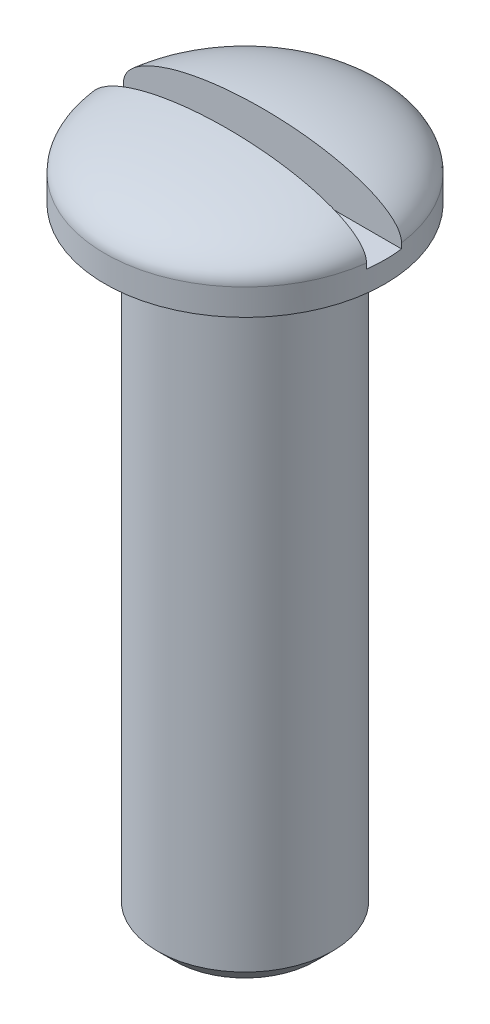
ISO-10303-21;
HEADER;
FILE_DESCRIPTION(('STEP AP214'),'2;1');
FILE_NAME('part.step','',(''),(''),'','','');
FILE_SCHEMA(('AUTOMOTIVE_DESIGN { 1 0 10303 214 1 1 1 1 }'));
ENDSEC;
DATA;
#1=APPLICATION_CONTEXT('core data for automotive mechanical design processes');
#2=APPLICATION_PROTOCOL_DEFINITION('international standard','automotive_design',2000,#1);
#3=PRODUCT_CONTEXT('',#1,'mechanical');
#4=PRODUCT('Part','Part','',(#3));
#5=PRODUCT_RELATED_PRODUCT_CATEGORY('part','',(#4));
#6=PRODUCT_DEFINITION_FORMATION('','',#4);
#7=PRODUCT_DEFINITION_CONTEXT('part definition',#1,'design');
#8=PRODUCT_DEFINITION('design','',#6,#7);
#9=PRODUCT_DEFINITION_SHAPE('','',#8);
#10=(LENGTH_UNIT() NAMED_UNIT(*) SI_UNIT(.MILLI.,.METRE.));
#11=(NAMED_UNIT(*) PLANE_ANGLE_UNIT() SI_UNIT($,.RADIAN.));
#12=(NAMED_UNIT(*) SI_UNIT($,.STERADIAN.) SOLID_ANGLE_UNIT());
#13=UNCERTAINTY_MEASURE_WITH_UNIT(LENGTH_MEASURE(1.E-05),#10,'distance_accuracy_value','');
#14=(GEOMETRIC_REPRESENTATION_CONTEXT(3) GLOBAL_UNCERTAINTY_ASSIGNED_CONTEXT((#13)) GLOBAL_UNIT_ASSIGNED_CONTEXT((#10,
#11,#12)) REPRESENTATION_CONTEXT('',''));
#15=CARTESIAN_POINT('',(0.,0.,0.));
#16=DIRECTION('',(0.,0.,1.));
#17=DIRECTION('',(1.,0.,0.));
#18=AXIS2_PLACEMENT_3D('',#15,#16,#17);
#19=CARTESIAN_POINT('',(0.,37.,0.));
#20=DIRECTION('',(0.,0.,1.));
#21=DIRECTION('',(1.,0.,0.));
#22=AXIS2_PLACEMENT_3D('',#19,#20,#21);
#23=ELLIPSE('',#22,8.,2.7);
#24=TRIMMED_CURVE('',#23,(PARAMETER_VALUE(-1.5707963267949)),(PARAMETER_VALUE(1.5707963267949)),
.T.,.PARAMETER.);
#25=CARTESIAN_POINT('',(0.,0.,0.));
#26=DIRECTION('',(0.,-1.,0.));
#27=AXIS1_PLACEMENT('',#25,#26);
#28=SURFACE_OF_REVOLUTION('',#24,#27);
#29=CARTESIAN_POINT('',(-7.93725393319377,37.,-1.));
#30=CARTESIAN_POINT('',(-7.9372679539927,37.028425186696,-1.));
#31=CARTESIAN_POINT('',(-7.93591384815377,37.0568421998398,-1.));
#32=CARTESIAN_POINT('',(-7.93057860445809,37.1133921509441,-1.));
#33=CARTESIAN_POINT('',(-7.92660092033622,37.141525413073,-1.));
#34=CARTESIAN_POINT('',(-7.91619381617088,37.1969612867804,-1.));
#35=CARTESIAN_POINT('',(-7.9097962183802,37.2242699119832,-1.));
#36=CARTESIAN_POINT('',(-7.89472838102949,37.2782541235067,-0.999999999999999));
#37=CARTESIAN_POINT('',(-7.88605729440098,37.3049294698286,-0.999999999999997));
#38=CARTESIAN_POINT('',(-7.85178063449509,37.3977492993282,-0.999999999999993));
#39=CARTESIAN_POINT('',(-7.82055716977038,37.461864801042,-0.999999999999998));
#40=CARTESIAN_POINT('',(-7.74825690551775,37.5844958132068,-1.));
#41=CARTESIAN_POINT('',(-7.70712574237137,37.6429778439168,-1.));
#42=CARTESIAN_POINT('',(-7.62460477383432,37.7460593120359,-1.));
#43=CARTESIAN_POINT('',(-7.58416021714071,37.7914307085018,-1.));
#44=CARTESIAN_POINT('',(-7.49949954701128,37.8785364853327,-1.));
#45=CARTESIAN_POINT('',(-7.45528055201993,37.920268036859,-1.));
#46=CARTESIAN_POINT('',(-7.36394506845197,38.0005355231512,-1.));
#47=CARTESIAN_POINT('',(-7.31682453080931,38.0390668075451,-1.));
#48=CARTESIAN_POINT('',(-7.22040376655296,38.1132464906887,-1.));
#49=CARTESIAN_POINT('',(-7.17110414952075,38.1488956878849,-1.));
#50=CARTESIAN_POINT('',(-7.05152178589472,38.2308701890934,-1.));
#51=CARTESIAN_POINT('',(-6.98044898629355,38.2760404643861,-1.));
#52=CARTESIAN_POINT('',(-6.8358482477968,38.3622929197311,-1.));
#53=CARTESIAN_POINT('',(-6.76231921632544,38.4033732472718,-1.));
#54=CARTESIAN_POINT('',(-6.61329455065616,38.4820633862059,-1.));
#55=CARTESIAN_POINT('',(-6.53779612171528,38.5196678782305,-1.));
#56=CARTESIAN_POINT('',(-6.38533535109786,38.5917942620324,-1.));
#57=CARTESIAN_POINT('',(-6.30837275926801,38.6263156212117,-1.));
#58=CARTESIAN_POINT('',(-6.07504498630673,38.7261169145836,-1.));
#59=CARTESIAN_POINT('',(-5.91691686569097,38.7872866492436,-1.));
#60=CARTESIAN_POINT('',(-5.59773824980062,38.9007826154434,-1.));
#61=CARTESIAN_POINT('',(-5.43669046126721,38.9531166162706,-1.));
#62=CARTESIAN_POINT('',(-5.11838729614728,39.0486486509022,-1.));
#63=CARTESIAN_POINT('',(-4.96121112165104,39.092112450686,-1.));
#64=CARTESIAN_POINT('',(-4.64533614080023,39.173148532359,-1.));
#65=CARTESIAN_POINT('',(-4.4866371255672,39.2107199934119,-1.));
#66=CARTESIAN_POINT('',(-4.1678604359053,39.2806895318816,-1.));
#67=CARTESIAN_POINT('',(-4.00778105851083,39.313079811176,-1.));
#68=CARTESIAN_POINT('',(-3.68673226498379,39.3731227554639,-1.));
#69=CARTESIAN_POINT('',(-3.52576278469573,39.4007750742435,-1.));
#70=CARTESIAN_POINT('',(-3.0416024744178,39.4772597557472,-1.));
#71=CARTESIAN_POINT('',(-2.7173689548059,39.5195751626911,-1.));
#72=CARTESIAN_POINT('',(-2.06670375945056,39.5889826128706,-1.));
#73=CARTESIAN_POINT('',(-1.74026908381822,39.6160456762821,-1.));
#74=CARTESIAN_POINT('',(-1.0868675348501,39.6559517029133,-1.));
#75=CARTESIAN_POINT('',(-0.759901523204662,39.6688088956982,-1.));
#76=CARTESIAN_POINT('',(-0.105842030838195,39.6808640766637,-1.));
#77=CARTESIAN_POINT('',(0.221251354184301,39.6800672551695,-1.));
#78=CARTESIAN_POINT('',(0.805290745504496,39.6664179409489,-1.));
#79=CARTESIAN_POINT('',(1.06230047698938,39.6561762053847,-1.));
#80=CARTESIAN_POINT('',(1.5758871235112,39.6269652511818,-1.));
#81=CARTESIAN_POINT('',(1.83246393174541,39.6079941266835,-1.));
#82=CARTESIAN_POINT('',(2.34490379464668,39.5608224933159,-1.));
#83=CARTESIAN_POINT('',(2.60076642804317,39.5326173721284,-1.));
#84=CARTESIAN_POINT('',(3.10976030056053,39.4663704493105,-1.));
#85=CARTESIAN_POINT('',(3.36289880378432,39.4283851568984,-1.));
#86=CARTESIAN_POINT('',(3.86716913883653,39.3413164140507,-1.));
#87=CARTESIAN_POINT('',(4.11830173526058,39.2922374239431,-1.));
#88=CARTESIAN_POINT('',(4.61755910251831,39.1811940716012,-1.));
#89=CARTESIAN_POINT('',(4.86568622251569,39.1192405666533,-1.));
#90=CARTESIAN_POINT('',(5.20204631769779,39.0236658400096,-1.));
#91=CARTESIAN_POINT('',(5.29223913160667,38.9968795643075,-1.));
#92=CARTESIAN_POINT('',(5.47189294855613,38.9409436912467,-1.));
#93=CARTESIAN_POINT('',(5.5613539536697,38.9117941005851,-1.));
#94=CARTESIAN_POINT('',(5.73961871133747,38.8508089779762,-1.));
#95=CARTESIAN_POINT('',(5.82842014912198,38.8189666570215,-1.));
#96=CARTESIAN_POINT('',(6.00491789080109,38.7523528819634,-1.));
#97=CARTESIAN_POINT('',(6.09261423406394,38.7175815325458,-1.));
#98=CARTESIAN_POINT('',(6.2776295683126,38.6401174364544,-1.));
#99=CARTESIAN_POINT('',(6.37476339184213,38.5969789898256,-1.));
#100=CARTESIAN_POINT('',(6.56669545755528,38.5057942312038,-1.));
#101=CARTESIAN_POINT('',(6.66149417144632,38.4577489206899,-1.));
#102=CARTESIAN_POINT('',(6.84759019964439,38.3559697683412,-1.));
#103=CARTESIAN_POINT('',(6.93889852072794,38.302256240792,-1.));
#104=CARTESIAN_POINT('',(7.11693757439327,38.187786452014,-1.));
#105=CARTESIAN_POINT('',(7.20367310459747,38.1270377947718,-1.));
#106=CARTESIAN_POINT('',(7.35169707600426,38.0113239182405,-1.));
#107=CARTESIAN_POINT('',(7.41433656069576,37.9581066351191,-1.));
#108=CARTESIAN_POINT('',(7.53389423860408,37.8452426401833,-1.));
#109=CARTESIAN_POINT('',(7.59079865654612,37.7855811292181,-1.));
#110=CARTESIAN_POINT('',(7.69680275770274,37.6577690604176,-1.));
#111=CARTESIAN_POINT('',(7.7457630485013,37.5894979859558,-0.999999999999999));
#112=CARTESIAN_POINT('',(7.80882672013688,37.481331738079,-1.));
#113=CARTESIAN_POINT('',(7.82807745616976,37.4444318562314,-1.));
#114=CARTESIAN_POINT('',(7.86249520103261,37.3687911619656,-0.999999999999999));
#115=CARTESIAN_POINT('',(7.87766543085493,37.3300518301273,-0.999999999999997));
#116=CARTESIAN_POINT('',(7.90549829208587,37.2439124725726,-0.999999999999997));
#117=CARTESIAN_POINT('',(7.91723093808099,37.1962001972984,-0.999999999999999));
#118=CARTESIAN_POINT('',(7.92915192399331,37.123467437178,-1.));
#119=CARTESIAN_POINT('',(7.93217994650022,37.0988886368039,-1.));
#120=CARTESIAN_POINT('',(7.93623444838613,37.0495440864978,-1.));
#121=CARTESIAN_POINT('',(7.93725906810871,37.0247781842705,-1.));
#122=CARTESIAN_POINT('',(7.93725393319377,37.,-1.));
#123=B_SPLINE_CURVE_WITH_KNOTS('',3,(#29,#30,#31,#32,#33,#34,#35,#36,#37,#38,#39,#40,#41,#42,
#43,#44,#45,#46,#47,#48,#49,#50,#51,#52,#53,#54,#55,#56,#57,#58,#59,#60,#61,#62,#63,#64,#65,#66,
#67,#68,#69,#70,#71,#72,#73,#74,#75,#76,#77,#78,#79,#80,#81,#82,#83,#84,#85,#86,#87,#88,#89,#90,
#91,#92,#93,#94,#95,#96,#97,#98,#99,#100,#101,#102,#103,#104,#105,#106,#107,#108,#109,#110,#111,
#112,#113,#114,#115,#116,#117,#118,#119,#120,#121,#122),.UNSPECIFIED.,.F.,.F.,(4,2,2,2,2,2,2,2,
2,2,2,2,2,2,2,2,2,2,2,2,2,2,2,2,2,2,2,2,2,2,2,2,2,2,2,2,2,2,2,2,2,2,2,2,2,2,4),(0.,
0.085230121730039,0.170348268030959,0.254383958606268,0.33845100424637,0.551085654244598,
0.764914730326498,0.946993520486736,1.12921258182631,1.31169195823799,1.494120606517,
1.7465796309848,1.99915248957964,2.25210569478696,2.50510251241691,3.01337352121526,
3.52119525149152,4.01028728520159,4.49944739181178,4.98933693637674,5.47926226308226,
6.45975371972949,7.44210190711809,8.42346521325528,9.40445548025946,10.1759607647509,
10.9476345695116,11.7196944096484,12.487389709664,13.2547768976915,14.0215195429876,
14.3037539915994,14.5859876404534,14.8689553875985,15.1519130255422,15.4706443815909,
15.7893108148479,16.1068716569271,16.4240924087716,16.6703252972271,16.917136190868,
17.1678947543991,17.2925517948105,17.4171101451146,17.5638867740028,17.6381082525873,
17.71239859453),.UNSPECIFIED.);
#124=CARTESIAN_POINT('',(-7.93725393319377,37.,-1.));
#125=VERTEX_POINT('',#124);
#126=CARTESIAN_POINT('',(7.93725393319377,37.,-1.));
#127=VERTEX_POINT('',#126);
#128=EDGE_CURVE('E107',#125,#127,#123,.T.);
#129=ORIENTED_EDGE('',*,*,#128,.T.);
#130=CARTESIAN_POINT('',(0.,37.,0.));
#131=DIRECTION('',(0.,1.,0.));
#132=DIRECTION('',(1.,0.,0.));
#133=AXIS2_PLACEMENT_3D('',#130,#131,#132);
#134=CIRCLE('',#133,8.);
#135=EDGE_CURVE('E151',#127,#125,#134,.T.);
#136=ORIENTED_EDGE('',*,*,#135,.T.);
#137=EDGE_LOOP('',(#129,#136));
#138=FACE_BOUND('',#137,.T.);
#139=ADVANCED_FACE('F45',(#138),#28,.F.);
#140=CARTESIAN_POINT('',(0.,0.,0.));
#141=DIRECTION('',(0.,-1.,0.));
#142=DIRECTION('',(1.,0.,0.));
#143=AXIS2_PLACEMENT_3D('',#140,#141,#142);
#144=PLANE('',#143);
#145=CARTESIAN_POINT('',(0.,0.,0.));
#146=DIRECTION('',(0.,1.,0.));
#147=DIRECTION('',(1.,0.,0.));
#148=AXIS2_PLACEMENT_3D('',#145,#146,#147);
#149=CIRCLE('',#148,3.99999999999999);
#150=CARTESIAN_POINT('',(3.99999999999999,0.,0.));
#151=VERTEX_POINT('',#150);
#152=EDGE_CURVE('E160',#151,#151,#149,.T.);
#153=ORIENTED_EDGE('',*,*,#152,.F.);
#154=EDGE_LOOP('',(#153));
#155=FACE_BOUND('',#154,.T.);
#156=ADVANCED_FACE('F174',(#155),#144,.T.);
#157=CARTESIAN_POINT('',(0.,0.,0.));
#158=DIRECTION('',(0.,-1.,0.));
#159=DIRECTION('',(1.,0.,0.));
#160=AXIS2_PLACEMENT_3D('',#157,#158,#159);
#161=CYLINDRICAL_SURFACE('',#160,5.);
#162=CARTESIAN_POINT('',(0.,1.00000000000001,0.));
#163=DIRECTION('',(0.,1.,0.));
#164=DIRECTION('',(1.,0.,0.));
#165=AXIS2_PLACEMENT_3D('',#162,#163,#164);
#166=CIRCLE('',#165,5.);
#167=CARTESIAN_POINT('',(5.,1.00000000000001,0.));
#168=VERTEX_POINT('',#167);
#169=EDGE_CURVE('E117',#168,#168,#166,.F.);
#170=ORIENTED_EDGE('',*,*,#169,.F.);
#171=EDGE_LOOP('',(#170));
#172=FACE_BOUND('',#171,.T.);
#173=CARTESIAN_POINT('',(0.,35.5,0.));
#174=DIRECTION('',(0.,1.,0.));
#175=DIRECTION('',(1.,0.,0.));
#176=AXIS2_PLACEMENT_3D('',#173,#174,#175);
#177=CIRCLE('',#176,5.);
#178=CARTESIAN_POINT('',(5.,35.5,0.));
#179=VERTEX_POINT('',#178);
#180=EDGE_CURVE('E156',#179,#179,#177,.T.);
#181=ORIENTED_EDGE('',*,*,#180,.F.);
#182=EDGE_LOOP('',(#181));
#183=FACE_BOUND('',#182,.T.);
#184=ADVANCED_FACE('F170',(#172,#183),#161,.T.);
#185=CARTESIAN_POINT('',(5.,35.5,0.));
#186=DIRECTION('',(0.,-1.,0.));
#187=DIRECTION('',(1.,0.,0.));
#188=AXIS2_PLACEMENT_3D('',#185,#186,#187);
#189=PLANE('',#188);
#190=CARTESIAN_POINT('',(0.,35.5,0.));
#191=DIRECTION('',(0.,1.,0.));
#192=DIRECTION('',(1.,0.,0.));
#193=AXIS2_PLACEMENT_3D('',#190,#191,#192);
#194=CIRCLE('',#193,8.);
#195=CARTESIAN_POINT('',(8.,35.5,0.));
#196=VERTEX_POINT('',#195);
#197=EDGE_CURVE('E152',#196,#196,#194,.T.);
#198=ORIENTED_EDGE('',*,*,#197,.F.);
#199=EDGE_LOOP('',(#198));
#200=FACE_BOUND('',#199,.T.);
#201=ORIENTED_EDGE('',*,*,#180,.T.);
#202=EDGE_LOOP('',(#201));
#203=FACE_BOUND('',#202,.T.);
#204=ADVANCED_FACE('F173',(#200,#203),#189,.T.);
#205=CARTESIAN_POINT('',(0.,0.,0.));
#206=DIRECTION('',(0.,-1.,0.));
#207=DIRECTION('',(1.,0.,0.));
#208=AXIS2_PLACEMENT_3D('',#205,#206,#207);
#209=CYLINDRICAL_SURFACE('',#208,8.);
#210=DIRECTION('',(0.,-1.,0.));
#211=VECTOR('',#210,1.);
#212=CARTESIAN_POINT('',(-7.93725393319377,0.,-1.));
#213=LINE('',#212,#211);
#214=CARTESIAN_POINT('',(-7.93725393319377,36.7,-1.));
#215=VERTEX_POINT('',#214);
#216=EDGE_CURVE('E146',#215,#125,#213,.F.);
#217=ORIENTED_EDGE('',*,*,#216,.T.);
#218=ORIENTED_EDGE('',*,*,#135,.F.);
#219=DIRECTION('',(0.,-1.,0.));
#220=VECTOR('',#219,1.);
#221=CARTESIAN_POINT('',(7.93725393319377,0.,-1.));
#222=LINE('',#221,#220);
#223=CARTESIAN_POINT('',(7.93725393319377,36.7,-1.));
#224=VERTEX_POINT('',#223);
#225=EDGE_CURVE('E69',#127,#224,#222,.T.);
#226=ORIENTED_EDGE('',*,*,#225,.T.);
#227=CARTESIAN_POINT('',(0.,36.7,0.));
#228=DIRECTION('',(0.,1.,0.));
#229=DIRECTION('',(0.,0.,1.));
#230=AXIS2_PLACEMENT_3D('',#227,#228,#229);
#231=CIRCLE('',#230,8.);
#232=CARTESIAN_POINT('',(7.93725393319377,36.7,1.));
#233=VERTEX_POINT('',#232);
#234=EDGE_CURVE('E49',#224,#233,#231,.F.);
#235=ORIENTED_EDGE('',*,*,#234,.T.);
#236=DIRECTION('',(0.,-1.,0.));
#237=VECTOR('',#236,1.);
#238=CARTESIAN_POINT('',(7.93725393319377,0.,1.));
#239=LINE('',#238,#237);
#240=CARTESIAN_POINT('',(7.93725393319377,37.,1.));
#241=VERTEX_POINT('',#240);
#242=EDGE_CURVE('E97',#233,#241,#239,.F.);
#243=ORIENTED_EDGE('',*,*,#242,.T.);
#244=CARTESIAN_POINT('',(-7.93725393319377,37.,1.));
#245=VERTEX_POINT('',#244);
#246=EDGE_CURVE('E148',#245,#241,#134,.T.);
#247=ORIENTED_EDGE('',*,*,#246,.F.);
#248=DIRECTION('',(0.,-1.,0.));
#249=VECTOR('',#248,1.);
#250=CARTESIAN_POINT('',(-7.93725393319377,0.,1.));
#251=LINE('',#250,#249);
#252=CARTESIAN_POINT('',(-7.93725393319377,36.7,1.));
#253=VERTEX_POINT('',#252);
#254=EDGE_CURVE('E102',#245,#253,#251,.T.);
#255=ORIENTED_EDGE('',*,*,#254,.T.);
#256=EDGE_CURVE('E11',#253,#215,#231,.F.);
#257=ORIENTED_EDGE('',*,*,#256,.T.);
#258=EDGE_LOOP('',(#217,#218,#226,#235,#243,#247,#255,#257));
#259=FACE_BOUND('',#258,.T.);
#260=ORIENTED_EDGE('',*,*,#197,.T.);
#261=EDGE_LOOP('',(#260));
#262=FACE_BOUND('',#261,.T.);
#263=ADVANCED_FACE('F104',(#259,#262),#209,.T.);
#264=CARTESIAN_POINT('',(7.93725393319377,37.,1.));
#265=CARTESIAN_POINT('',(7.9372679539927,37.028425186696,1.));
#266=CARTESIAN_POINT('',(7.93591384815377,37.0568421998398,1.));
#267=CARTESIAN_POINT('',(7.93057860445809,37.1133921509441,1.));
#268=CARTESIAN_POINT('',(7.92660092033622,37.141525413073,1.));
#269=CARTESIAN_POINT('',(7.91619381617087,37.1969612867804,1.));
#270=CARTESIAN_POINT('',(7.9097962183802,37.2242699119832,1.));
#271=CARTESIAN_POINT('',(7.89472838102949,37.2782541235067,0.999999999999999));
#272=CARTESIAN_POINT('',(7.88605729440098,37.3049294698286,0.999999999999998));
#273=CARTESIAN_POINT('',(7.85178063449509,37.3977492993282,0.999999999999995));
#274=CARTESIAN_POINT('',(7.82055716977038,37.461864801042,0.999999999999998));
#275=CARTESIAN_POINT('',(7.74825690551775,37.5844958132068,1.));
#276=CARTESIAN_POINT('',(7.70712574237137,37.6429778439168,1.));
#277=CARTESIAN_POINT('',(7.62460477383432,37.7460593120359,1.));
#278=CARTESIAN_POINT('',(7.58416021714071,37.7914307085019,1.));
#279=CARTESIAN_POINT('',(7.49949954701128,37.8785364853327,1.));
#280=CARTESIAN_POINT('',(7.45528055201992,37.920268036859,1.));
#281=CARTESIAN_POINT('',(7.36394506845197,38.0005355231512,1.));
#282=CARTESIAN_POINT('',(7.31682453080931,38.0390668075451,1.));
#283=CARTESIAN_POINT('',(7.22040376655296,38.1132464906887,1.));
#284=CARTESIAN_POINT('',(7.17110414952075,38.1488956878849,1.));
#285=CARTESIAN_POINT('',(7.05152178589472,38.2308701890934,1.));
#286=CARTESIAN_POINT('',(6.98044898629355,38.2760404643861,1.));
#287=CARTESIAN_POINT('',(6.8358482477968,38.3622929197311,0.999999999999999));
#288=CARTESIAN_POINT('',(6.76231921632544,38.4033732472718,1.));
#289=CARTESIAN_POINT('',(6.61329455065617,38.4820633862059,1.));
#290=CARTESIAN_POINT('',(6.53779612171528,38.5196678782305,1.));
#291=CARTESIAN_POINT('',(6.38533535109786,38.5917942620324,1.));
#292=CARTESIAN_POINT('',(6.30837275926801,38.6263156212117,1.));
#293=CARTESIAN_POINT('',(6.07504498630673,38.7261169145836,1.));
#294=CARTESIAN_POINT('',(5.91691686569096,38.7872866492436,1.));
#295=CARTESIAN_POINT('',(5.59773824980061,38.9007826154434,1.));
#296=CARTESIAN_POINT('',(5.4366904612672,38.9531166162706,1.));
#297=CARTESIAN_POINT('',(5.11838729614728,39.0486486509022,1.));
#298=CARTESIAN_POINT('',(4.96121112165104,39.092112450686,1.));
#299=CARTESIAN_POINT('',(4.64533614080023,39.173148532359,1.));
#300=CARTESIAN_POINT('',(4.4866371255672,39.2107199934119,1.));
#301=CARTESIAN_POINT('',(4.1678604359053,39.2806895318816,1.));
#302=CARTESIAN_POINT('',(4.00778105851082,39.313079811176,1.));
#303=CARTESIAN_POINT('',(3.68673226498379,39.3731227554639,1.));
#304=CARTESIAN_POINT('',(3.52576278469573,39.4007750742435,1.));
#305=CARTESIAN_POINT('',(3.04160247441779,39.4772597557472,1.));
#306=CARTESIAN_POINT('',(2.7173689548059,39.5195751626911,1.));
#307=CARTESIAN_POINT('',(2.06670375945055,39.5889826128706,1.));
#308=CARTESIAN_POINT('',(1.74026908381821,39.6160456762821,1.));
#309=CARTESIAN_POINT('',(1.0868675348501,39.6559517029133,1.));
#310=CARTESIAN_POINT('',(0.759901523204655,39.6688088956982,1.));
#311=CARTESIAN_POINT('',(0.105842030838188,39.6808640766637,1.));
#312=CARTESIAN_POINT('',(-0.221251354184309,39.6800672551695,0.999999999999999));
#313=CARTESIAN_POINT('',(-0.805290745504502,39.6664179409489,0.999999999999999));
#314=CARTESIAN_POINT('',(-1.06230047698939,39.6561762053847,1.));
#315=CARTESIAN_POINT('',(-1.5758871235112,39.6269652511818,1.));
#316=CARTESIAN_POINT('',(-1.83246393174541,39.6079941266835,1.));
#317=CARTESIAN_POINT('',(-2.34490379464668,39.5608224933159,1.));
#318=CARTESIAN_POINT('',(-2.60076642804317,39.5326173721284,1.));
#319=CARTESIAN_POINT('',(-3.10976030056052,39.4663704493105,1.));
#320=CARTESIAN_POINT('',(-3.36289880378431,39.4283851568984,1.));
#321=CARTESIAN_POINT('',(-3.86716913883652,39.3413164140507,1.));
#322=CARTESIAN_POINT('',(-4.11830173526056,39.2922374239431,1.));
#323=CARTESIAN_POINT('',(-4.61755910251829,39.1811940716012,1.));
#324=CARTESIAN_POINT('',(-4.86568622251567,39.1192405666533,1.));
#325=CARTESIAN_POINT('',(-5.20204631769776,39.0236658400096,1.));
#326=CARTESIAN_POINT('',(-5.29223913160664,38.9968795643075,1.));
#327=CARTESIAN_POINT('',(-5.47189294855611,38.9409436912467,1.));
#328=CARTESIAN_POINT('',(-5.56135395366969,38.9117941005851,1.));
#329=CARTESIAN_POINT('',(-5.73961871133745,38.8508089779762,1.));
#330=CARTESIAN_POINT('',(-5.82842014912197,38.8189666570215,1.));
#331=CARTESIAN_POINT('',(-6.00491789080107,38.7523528819634,1.));
#332=CARTESIAN_POINT('',(-6.09261423406392,38.7175815325458,1.));
#333=CARTESIAN_POINT('',(-6.27762956831259,38.6401174364544,1.));
#334=CARTESIAN_POINT('',(-6.37476339184211,38.5969789898256,1.));
#335=CARTESIAN_POINT('',(-6.56669545755526,38.5057942312038,1.));
#336=CARTESIAN_POINT('',(-6.66149417144631,38.4577489206899,1.));
#337=CARTESIAN_POINT('',(-6.84759019964437,38.3559697683412,1.));
#338=CARTESIAN_POINT('',(-6.93889852072792,38.302256240792,1.));
#339=CARTESIAN_POINT('',(-7.11693757439326,38.187786452014,1.));
#340=CARTESIAN_POINT('',(-7.20367310459746,38.1270377947718,1.));
#341=CARTESIAN_POINT('',(-7.35169707600426,38.0113239182405,1.));
#342=CARTESIAN_POINT('',(-7.41433656069576,37.9581066351191,1.));
#343=CARTESIAN_POINT('',(-7.53389423860408,37.8452426401833,1.));
#344=CARTESIAN_POINT('',(-7.59079865654611,37.7855811292181,0.999999999999999));
#345=CARTESIAN_POINT('',(-7.69680275770273,37.6577690604176,0.999999999999999));
#346=CARTESIAN_POINT('',(-7.74576304850129,37.5894979859559,0.999999999999999));
#347=CARTESIAN_POINT('',(-7.80882672013687,37.481331738079,1.));
#348=CARTESIAN_POINT('',(-7.82807745616975,37.4444318562314,1.));
#349=CARTESIAN_POINT('',(-7.8624952010326,37.3687911619656,0.999999999999999));
#350=CARTESIAN_POINT('',(-7.87766543085493,37.3300518301273,0.999999999999997));
#351=CARTESIAN_POINT('',(-7.90549829208588,37.2439124725726,0.999999999999996));
#352=CARTESIAN_POINT('',(-7.91723093808099,37.1962001972984,0.999999999999999));
#353=CARTESIAN_POINT('',(-7.92915192399331,37.123467437178,1.));
#354=CARTESIAN_POINT('',(-7.93217994650022,37.0988886368039,1.));
#355=CARTESIAN_POINT('',(-7.93623444838613,37.0495440864978,1.));
#356=CARTESIAN_POINT('',(-7.93725906810871,37.0247781842705,0.999999999999999));
#357=CARTESIAN_POINT('',(-7.93725393319377,37.,0.999999999999999));
#358=B_SPLINE_CURVE_WITH_KNOTS('',3,(#264,#265,#266,#267,#268,#269,#270,#271,#272,#273,#274,
#275,#276,#277,#278,#279,#280,#281,#282,#283,#284,#285,#286,#287,#288,#289,#290,#291,#292,#293,
#294,#295,#296,#297,#298,#299,#300,#301,#302,#303,#304,#305,#306,#307,#308,#309,#310,#311,#312,
#313,#314,#315,#316,#317,#318,#319,#320,#321,#322,#323,#324,#325,#326,#327,#328,#329,#330,#331,
#332,#333,#334,#335,#336,#337,#338,#339,#340,#341,#342,#343,#344,#345,#346,#347,#348,#349,#350,
#351,#352,#353,#354,#355,#356,#357),.UNSPECIFIED.,.F.,.F.,(4,2,2,2,2,2,2,2,2,2,2,2,2,2,2,2,2,2,
2,2,2,2,2,2,2,2,2,2,2,2,2,2,2,2,2,2,2,2,2,2,2,2,2,2,2,2,4),(0.,0.085230121730039,
0.17034826803096,0.254383958606268,0.33845100424637,0.551085654244604,0.764914730326505,
0.946993520486745,1.12921258182632,1.311691958238,1.494120606517,1.7465796309848,
1.99915248957964,2.25210569478696,2.50510251241692,3.01337352121526,3.52119525149153,
4.0102872852016,4.49944739181178,4.98933693637675,5.47926226308226,6.4597537197295,
7.44210190711809,8.42346521325529,9.40445548025947,10.1759607647509,10.9476345695116,
11.7196944096484,12.487389709664,13.2547768976915,14.0215195429876,14.3037539915994,
14.5859876404534,14.8689553875985,15.1519130255421,15.4706443815909,15.7893108148479,
16.1068716569271,16.4240924087716,16.6703252972271,16.917136190868,17.1678947543991,
17.2925517948105,17.4171101451146,17.5638867740028,17.6381082525873,17.71239859453),.UNSPECIFIED.);
#359=EDGE_CURVE('E61',#241,#245,#358,.T.);
#360=ORIENTED_EDGE('',*,*,#359,.T.);
#361=ORIENTED_EDGE('',*,*,#246,.T.);
#362=EDGE_LOOP('',(#360,#361));
#363=FACE_BOUND('',#362,.T.);
#364=ADVANCED_FACE('F134',(#363),#28,.F.);
#365=CARTESIAN_POINT('',(0.,0.,0.));
#366=DIRECTION('',(0.,1.,0.));
#367=DIRECTION('',(-1.,0.,0.));
#368=AXIS2_PLACEMENT_3D('',#365,#366,#367);
#369=CONICAL_SURFACE('',#368,3.99999999999999,0.78539816339745);
#370=ORIENTED_EDGE('',*,*,#169,.T.);
#371=EDGE_LOOP('',(#370));
#372=FACE_BOUND('',#371,.T.);
#373=ORIENTED_EDGE('',*,*,#152,.T.);
#374=EDGE_LOOP('',(#373));
#375=FACE_BOUND('',#374,.T.);
#376=ADVANCED_FACE('F47',(#372,#375),#369,.T.);
#377=CARTESIAN_POINT('',(-8.,36.7,-1.));
#378=DIRECTION('',(0.,0.,-1.));
#379=DIRECTION('',(1.,0.,0.));
#380=AXIS2_PLACEMENT_3D('',#377,#378,#379);
#381=PLANE('',#380);
#382=ORIENTED_EDGE('',*,*,#216,.F.);
#383=DIRECTION('',(1.,0.,0.));
#384=VECTOR('',#383,1.);
#385=CARTESIAN_POINT('',(-8.,36.7,-1.));
#386=LINE('',#385,#384);
#387=EDGE_CURVE('E94',#215,#224,#386,.T.);
#388=ORIENTED_EDGE('',*,*,#387,.T.);
#389=ORIENTED_EDGE('',*,*,#225,.F.);
#390=ORIENTED_EDGE('',*,*,#128,.F.);
#391=EDGE_LOOP('',(#382,#388,#389,#390));
#392=FACE_BOUND('',#391,.T.);
#393=ADVANCED_FACE('F131',(#392),#381,.F.);
#394=CARTESIAN_POINT('',(-8.,36.7,1.));
#395=DIRECTION('',(0.,0.,1.));
#396=DIRECTION('',(-1.,0.,0.));
#397=AXIS2_PLACEMENT_3D('',#394,#395,#396);
#398=PLANE('',#397);
#399=ORIENTED_EDGE('',*,*,#242,.F.);
#400=DIRECTION('',(-1.,0.,0.));
#401=VECTOR('',#400,1.);
#402=CARTESIAN_POINT('',(-8.,36.7,1.));
#403=LINE('',#402,#401);
#404=EDGE_CURVE('E89',#233,#253,#403,.T.);
#405=ORIENTED_EDGE('',*,*,#404,.T.);
#406=ORIENTED_EDGE('',*,*,#254,.F.);
#407=ORIENTED_EDGE('',*,*,#359,.F.);
#408=EDGE_LOOP('',(#399,#405,#406,#407));
#409=FACE_BOUND('',#408,.T.);
#410=ADVANCED_FACE('F98',(#409),#398,.F.);
#411=CARTESIAN_POINT('',(0.,36.7,0.));
#412=DIRECTION('',(0.,-1.,0.));
#413=DIRECTION('',(0.,0.,1.));
#414=AXIS2_PLACEMENT_3D('',#411,#412,#413);
#415=PLANE('',#414);
#416=ORIENTED_EDGE('',*,*,#404,.F.);
#417=ORIENTED_EDGE('',*,*,#234,.F.);
#418=ORIENTED_EDGE('',*,*,#387,.F.);
#419=ORIENTED_EDGE('',*,*,#256,.F.);
#420=EDGE_LOOP('',(#416,#417,#418,#419));
#421=FACE_BOUND('',#420,.T.);
#422=ADVANCED_FACE('F90',(#421),#415,.F.);
#423=CLOSED_SHELL('',(#139,#156,#184,#204,#263,#364,#376,#393,#410,#422));
#424=MANIFOLD_SOLID_BREP('B2',#423);
#425=ADVANCED_BREP_SHAPE_REPRESENTATION('',(#18,#424),#14);
#426=SHAPE_DEFINITION_REPRESENTATION(#9,#425);
ENDSEC;
END-ISO-10303-21;
